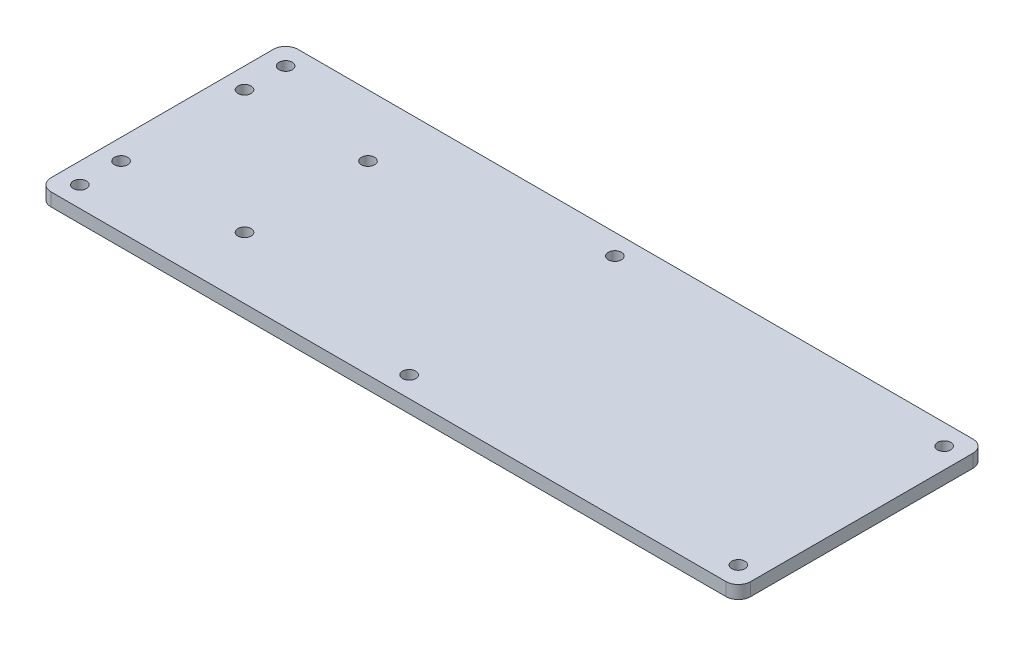
ISO-10303-21;
HEADER;
FILE_DESCRIPTION(('STEP AP214'),'2;1');
FILE_NAME('part.step','',(''),(''),'','','');
FILE_SCHEMA(('AUTOMOTIVE_DESIGN { 1 0 10303 214 1 1 1 1 }'));
ENDSEC;
DATA;
#1=APPLICATION_CONTEXT('core data for automotive mechanical design processes');
#2=APPLICATION_PROTOCOL_DEFINITION('international standard','automotive_design',2000,#1);
#3=PRODUCT_CONTEXT('',#1,'mechanical');
#4=PRODUCT('Part','Part','',(#3));
#5=PRODUCT_RELATED_PRODUCT_CATEGORY('part','',(#4));
#6=PRODUCT_DEFINITION_FORMATION('','',#4);
#7=PRODUCT_DEFINITION_CONTEXT('part definition',#1,'design');
#8=PRODUCT_DEFINITION('design','',#6,#7);
#9=PRODUCT_DEFINITION_SHAPE('','',#8);
#10=(LENGTH_UNIT() NAMED_UNIT(*) SI_UNIT(.MILLI.,.METRE.));
#11=(NAMED_UNIT(*) PLANE_ANGLE_UNIT() SI_UNIT($,.RADIAN.));
#12=(NAMED_UNIT(*) SI_UNIT($,.STERADIAN.) SOLID_ANGLE_UNIT());
#13=UNCERTAINTY_MEASURE_WITH_UNIT(LENGTH_MEASURE(1.E-05),#10,'distance_accuracy_value','');
#14=(GEOMETRIC_REPRESENTATION_CONTEXT(3) GLOBAL_UNCERTAINTY_ASSIGNED_CONTEXT((#13)) GLOBAL_UNIT_ASSIGNED_CONTEXT((#10,
#11,#12)) REPRESENTATION_CONTEXT('',''));
#15=CARTESIAN_POINT('',(0.,0.,0.));
#16=DIRECTION('',(0.,0.,1.));
#17=DIRECTION('',(1.,0.,0.));
#18=AXIS2_PLACEMENT_3D('',#15,#16,#17);
#19=CARTESIAN_POINT('',(85.,3.175,-30.));
#20=DIRECTION('',(-1.,0.,0.));
#21=DIRECTION('',(0.,0.,1.));
#22=AXIS2_PLACEMENT_3D('',#19,#20,#21);
#23=PLANE('',#22);
#24=DIRECTION('',(0.,0.,-1.));
#25=VECTOR('',#24,1.);
#26=CARTESIAN_POINT('',(85.,3.175,-30.));
#27=LINE('',#26,#25);
#28=CARTESIAN_POINT('',(85.,3.175,27.));
#29=VERTEX_POINT('',#28);
#30=CARTESIAN_POINT('',(85.,3.175,-27.));
#31=VERTEX_POINT('',#30);
#32=EDGE_CURVE('E119',#29,#31,#27,.T.);
#33=ORIENTED_EDGE('',*,*,#32,.F.);
#34=DIRECTION('',(0.,-1.,0.));
#35=VECTOR('',#34,1.);
#36=CARTESIAN_POINT('',(85.,3.175,27.));
#37=LINE('',#36,#35);
#38=CARTESIAN_POINT('',(85.,0.,27.));
#39=VERTEX_POINT('',#38);
#40=EDGE_CURVE('E104',#29,#39,#37,.T.);
#41=ORIENTED_EDGE('',*,*,#40,.T.);
#42=DIRECTION('',(0.,0.,-1.));
#43=VECTOR('',#42,1.);
#44=CARTESIAN_POINT('',(85.,0.,-30.));
#45=LINE('',#44,#43);
#46=CARTESIAN_POINT('',(85.,0.,-27.));
#47=VERTEX_POINT('',#46);
#48=EDGE_CURVE('E116',#39,#47,#45,.T.);
#49=ORIENTED_EDGE('',*,*,#48,.T.);
#50=DIRECTION('',(0.,-1.,0.));
#51=VECTOR('',#50,1.);
#52=CARTESIAN_POINT('',(85.,3.175,-27.));
#53=LINE('',#52,#51);
#54=EDGE_CURVE('E121',#47,#31,#53,.F.);
#55=ORIENTED_EDGE('',*,*,#54,.T.);
#56=EDGE_LOOP('',(#33,#41,#49,#55));
#57=FACE_BOUND('',#56,.T.);
#58=ADVANCED_FACE('F34',(#57),#23,.F.);
#59=CARTESIAN_POINT('',(-85.,3.175,-30.));
#60=DIRECTION('',(0.,0.,1.));
#61=DIRECTION('',(1.,0.,0.));
#62=AXIS2_PLACEMENT_3D('',#59,#60,#61);
#63=PLANE('',#62);
#64=DIRECTION('',(-1.,0.,0.));
#65=VECTOR('',#64,1.);
#66=CARTESIAN_POINT('',(-85.,3.175,-30.));
#67=LINE('',#66,#65);
#68=CARTESIAN_POINT('',(82.,3.175,-30.));
#69=VERTEX_POINT('',#68);
#70=CARTESIAN_POINT('',(-82.,3.175,-30.));
#71=VERTEX_POINT('',#70);
#72=EDGE_CURVE('E165',#69,#71,#67,.T.);
#73=ORIENTED_EDGE('',*,*,#72,.F.);
#74=DIRECTION('',(0.,-1.,0.));
#75=VECTOR('',#74,1.);
#76=CARTESIAN_POINT('',(82.,3.175,-30.));
#77=LINE('',#76,#75);
#78=CARTESIAN_POINT('',(82.,0.,-30.));
#79=VERTEX_POINT('',#78);
#80=EDGE_CURVE('E158',#69,#79,#77,.T.);
#81=ORIENTED_EDGE('',*,*,#80,.T.);
#82=DIRECTION('',(-1.,0.,0.));
#83=VECTOR('',#82,1.);
#84=CARTESIAN_POINT('',(-85.,0.,-30.));
#85=LINE('',#84,#83);
#86=CARTESIAN_POINT('',(-82.,0.,-30.));
#87=VERTEX_POINT('',#86);
#88=EDGE_CURVE('E125',#79,#87,#85,.T.);
#89=ORIENTED_EDGE('',*,*,#88,.T.);
#90=DIRECTION('',(0.,-1.,0.));
#91=VECTOR('',#90,1.);
#92=CARTESIAN_POINT('',(-82.,3.175,-30.));
#93=LINE('',#92,#91);
#94=EDGE_CURVE('E156',#87,#71,#93,.F.);
#95=ORIENTED_EDGE('',*,*,#94,.T.);
#96=EDGE_LOOP('',(#73,#81,#89,#95));
#97=FACE_BOUND('',#96,.T.);
#98=ADVANCED_FACE('F163',(#97),#63,.F.);
#99=CARTESIAN_POINT('',(-85.,3.175,-30.));
#100=DIRECTION('',(1.,0.,0.));
#101=DIRECTION('',(0.,0.,-1.));
#102=AXIS2_PLACEMENT_3D('',#99,#100,#101);
#103=PLANE('',#102);
#104=DIRECTION('',(0.,0.,1.));
#105=VECTOR('',#104,1.);
#106=CARTESIAN_POINT('',(-85.,3.175,-30.));
#107=LINE('',#106,#105);
#108=CARTESIAN_POINT('',(-85.,3.175,-27.));
#109=VERTEX_POINT('',#108);
#110=CARTESIAN_POINT('',(-85.,3.175,27.));
#111=VERTEX_POINT('',#110);
#112=EDGE_CURVE('E173',#109,#111,#107,.T.);
#113=ORIENTED_EDGE('',*,*,#112,.F.);
#114=DIRECTION('',(0.,-1.,0.));
#115=VECTOR('',#114,1.);
#116=CARTESIAN_POINT('',(-85.,3.175,-27.));
#117=LINE('',#116,#115);
#118=CARTESIAN_POINT('',(-85.,0.,-27.));
#119=VERTEX_POINT('',#118);
#120=EDGE_CURVE('E11',#109,#119,#117,.T.);
#121=ORIENTED_EDGE('',*,*,#120,.T.);
#122=DIRECTION('',(0.,0.,1.));
#123=VECTOR('',#122,1.);
#124=CARTESIAN_POINT('',(-85.,0.,-30.));
#125=LINE('',#124,#123);
#126=CARTESIAN_POINT('',(-85.,0.,27.));
#127=VERTEX_POINT('',#126);
#128=EDGE_CURVE('E129',#119,#127,#125,.T.);
#129=ORIENTED_EDGE('',*,*,#128,.T.);
#130=DIRECTION('',(0.,-1.,0.));
#131=VECTOR('',#130,1.);
#132=CARTESIAN_POINT('',(-85.,3.175,27.));
#133=LINE('',#132,#131);
#134=EDGE_CURVE('E42',#127,#111,#133,.F.);
#135=ORIENTED_EDGE('',*,*,#134,.T.);
#136=EDGE_LOOP('',(#113,#121,#129,#135));
#137=FACE_BOUND('',#136,.T.);
#138=ADVANCED_FACE('F172',(#137),#103,.F.);
#139=CARTESIAN_POINT('',(-85.,3.175,30.));
#140=DIRECTION('',(0.,0.,-1.));
#141=DIRECTION('',(-1.,0.,0.));
#142=AXIS2_PLACEMENT_3D('',#139,#140,#141);
#143=PLANE('',#142);
#144=DIRECTION('',(1.,0.,0.));
#145=VECTOR('',#144,1.);
#146=CARTESIAN_POINT('',(-85.,0.,30.));
#147=LINE('',#146,#145);
#148=CARTESIAN_POINT('',(-82.,0.,30.));
#149=VERTEX_POINT('',#148);
#150=CARTESIAN_POINT('',(82.,0.,30.));
#151=VERTEX_POINT('',#150);
#152=EDGE_CURVE('E139',#149,#151,#147,.T.);
#153=ORIENTED_EDGE('',*,*,#152,.T.);
#154=DIRECTION('',(0.,-1.,0.));
#155=VECTOR('',#154,1.);
#156=CARTESIAN_POINT('',(82.,3.175,30.));
#157=LINE('',#156,#155);
#158=CARTESIAN_POINT('',(82.,3.175,30.));
#159=VERTEX_POINT('',#158);
#160=EDGE_CURVE('E105',#151,#159,#157,.F.);
#161=ORIENTED_EDGE('',*,*,#160,.T.);
#162=DIRECTION('',(1.,0.,0.));
#163=VECTOR('',#162,1.);
#164=CARTESIAN_POINT('',(-85.,3.175,30.));
#165=LINE('',#164,#163);
#166=CARTESIAN_POINT('',(-82.,3.175,30.));
#167=VERTEX_POINT('',#166);
#168=EDGE_CURVE('E135',#167,#159,#165,.T.);
#169=ORIENTED_EDGE('',*,*,#168,.F.);
#170=DIRECTION('',(0.,-1.,0.));
#171=VECTOR('',#170,1.);
#172=CARTESIAN_POINT('',(-82.,3.175,30.));
#173=LINE('',#172,#171);
#174=EDGE_CURVE('E110',#167,#149,#173,.T.);
#175=ORIENTED_EDGE('',*,*,#174,.T.);
#176=EDGE_LOOP('',(#153,#161,#169,#175));
#177=FACE_BOUND('',#176,.T.);
#178=ADVANCED_FACE('F248',(#177),#143,.F.);
#179=CARTESIAN_POINT('',(0.,3.175,0.));
#180=DIRECTION('',(0.,1.,0.));
#181=DIRECTION('',(0.,0.,1.));
#182=AXIS2_PLACEMENT_3D('',#179,#180,#181);
#183=PLANE('',#182);
#184=CARTESIAN_POINT('',(-80.,3.175,-15.));
#185=DIRECTION('',(0.,1.,0.));
#186=DIRECTION('',(0.,0.,-1.));
#187=AXIS2_PLACEMENT_3D('',#184,#185,#186);
#188=CIRCLE('',#187,1.59999999999999);
#189=CARTESIAN_POINT('',(-80.,3.175,-16.6));
#190=VERTEX_POINT('',#189);
#191=EDGE_CURVE('E230',#190,#190,#188,.T.);
#192=ORIENTED_EDGE('',*,*,#191,.F.);
#193=EDGE_LOOP('',(#192));
#194=FACE_BOUND('',#193,.T.);
#195=CARTESIAN_POINT('',(-50.,3.175,-15.));
#196=DIRECTION('',(0.,1.,0.));
#197=DIRECTION('',(0.,0.,1.));
#198=AXIS2_PLACEMENT_3D('',#195,#196,#197);
#199=CIRCLE('',#198,1.59999999999999);
#200=CARTESIAN_POINT('',(-50.,3.175,-13.4));
#201=VERTEX_POINT('',#200);
#202=EDGE_CURVE('E224',#201,#201,#199,.T.);
#203=ORIENTED_EDGE('',*,*,#202,.F.);
#204=EDGE_LOOP('',(#203));
#205=FACE_BOUND('',#204,.T.);
#206=CARTESIAN_POINT('',(-50.,3.175,15.));
#207=DIRECTION('',(0.,1.,0.));
#208=DIRECTION('',(0.,0.,-1.));
#209=AXIS2_PLACEMENT_3D('',#206,#207,#208);
#210=CIRCLE('',#209,1.6);
#211=CARTESIAN_POINT('',(-50.,3.175,13.4));
#212=VERTEX_POINT('',#211);
#213=EDGE_CURVE('E218',#212,#212,#210,.T.);
#214=ORIENTED_EDGE('',*,*,#213,.F.);
#215=EDGE_LOOP('',(#214));
#216=FACE_BOUND('',#215,.T.);
#217=CARTESIAN_POINT('',(-80.,3.175,15.));
#218=DIRECTION('',(0.,1.,0.));
#219=DIRECTION('',(0.,0.,1.));
#220=AXIS2_PLACEMENT_3D('',#217,#218,#219);
#221=CIRCLE('',#220,1.6);
#222=CARTESIAN_POINT('',(-80.,3.175,16.6));
#223=VERTEX_POINT('',#222);
#224=EDGE_CURVE('E212',#223,#223,#221,.T.);
#225=ORIENTED_EDGE('',*,*,#224,.F.);
#226=EDGE_LOOP('',(#225));
#227=FACE_BOUND('',#226,.T.);
#228=CARTESIAN_POINT('',(0.,3.175,-25.));
#229=DIRECTION('',(0.,1.,0.));
#230=DIRECTION('',(0.,0.,-1.));
#231=AXIS2_PLACEMENT_3D('',#228,#229,#230);
#232=CIRCLE('',#231,1.6);
#233=CARTESIAN_POINT('',(0.,3.175,-26.6));
#234=VERTEX_POINT('',#233);
#235=EDGE_CURVE('E194',#234,#234,#232,.T.);
#236=ORIENTED_EDGE('',*,*,#235,.F.);
#237=EDGE_LOOP('',(#236));
#238=FACE_BOUND('',#237,.T.);
#239=CARTESIAN_POINT('',(0.,3.175,25.));
#240=DIRECTION('',(0.,1.,0.));
#241=DIRECTION('',(0.,0.,1.));
#242=AXIS2_PLACEMENT_3D('',#239,#240,#241);
#243=CIRCLE('',#242,1.6);
#244=CARTESIAN_POINT('',(0.,3.175,26.6));
#245=VERTEX_POINT('',#244);
#246=EDGE_CURVE('E201',#245,#245,#243,.T.);
#247=ORIENTED_EDGE('',*,*,#246,.F.);
#248=EDGE_LOOP('',(#247));
#249=FACE_BOUND('',#248,.T.);
#250=CARTESIAN_POINT('',(80.,3.175,25.));
#251=DIRECTION('',(0.,1.,0.));
#252=DIRECTION('',(0.,0.,-1.));
#253=AXIS2_PLACEMENT_3D('',#250,#251,#252);
#254=CIRCLE('',#253,1.6);
#255=CARTESIAN_POINT('',(80.,3.175,23.4));
#256=VERTEX_POINT('',#255);
#257=EDGE_CURVE('E207',#256,#256,#254,.T.);
#258=ORIENTED_EDGE('',*,*,#257,.F.);
#259=EDGE_LOOP('',(#258));
#260=FACE_BOUND('',#259,.T.);
#261=CARTESIAN_POINT('',(80.,3.175,-25.));
#262=DIRECTION('',(0.,1.,0.));
#263=DIRECTION('',(0.,0.,1.));
#264=AXIS2_PLACEMENT_3D('',#261,#262,#263);
#265=CIRCLE('',#264,1.6);
#266=CARTESIAN_POINT('',(80.,3.175,-23.4));
#267=VERTEX_POINT('',#266);
#268=EDGE_CURVE('E182',#267,#267,#265,.T.);
#269=ORIENTED_EDGE('',*,*,#268,.F.);
#270=EDGE_LOOP('',(#269));
#271=FACE_BOUND('',#270,.T.);
#272=CARTESIAN_POINT('',(-80.,3.175,-25.));
#273=DIRECTION('',(0.,1.,0.));
#274=DIRECTION('',(0.,0.,-1.));
#275=AXIS2_PLACEMENT_3D('',#272,#273,#274);
#276=CIRCLE('',#275,1.6);
#277=CARTESIAN_POINT('',(-80.,3.175,-26.6));
#278=VERTEX_POINT('',#277);
#279=EDGE_CURVE('E189',#278,#278,#276,.T.);
#280=ORIENTED_EDGE('',*,*,#279,.F.);
#281=EDGE_LOOP('',(#280));
#282=FACE_BOUND('',#281,.T.);
#283=CARTESIAN_POINT('',(-80.,3.175,25.));
#284=DIRECTION('',(0.,1.,0.));
#285=DIRECTION('',(0.,0.,1.));
#286=AXIS2_PLACEMENT_3D('',#283,#284,#285);
#287=CIRCLE('',#286,1.6);
#288=CARTESIAN_POINT('',(-80.,3.175,26.6));
#289=VERTEX_POINT('',#288);
#290=EDGE_CURVE('E132',#289,#289,#287,.T.);
#291=ORIENTED_EDGE('',*,*,#290,.F.);
#292=EDGE_LOOP('',(#291));
#293=FACE_BOUND('',#292,.T.);
#294=ORIENTED_EDGE('',*,*,#168,.T.);
#295=CARTESIAN_POINT('',(82.,3.175,27.));
#296=DIRECTION('',(0.,1.,0.));
#297=DIRECTION('',(0.,0.,1.));
#298=AXIS2_PLACEMENT_3D('',#295,#296,#297);
#299=CIRCLE('',#298,3.);
#300=EDGE_CURVE('E154',#159,#29,#299,.T.);
#301=ORIENTED_EDGE('',*,*,#300,.T.);
#302=ORIENTED_EDGE('',*,*,#32,.T.);
#303=CARTESIAN_POINT('',(82.,3.175,-27.));
#304=DIRECTION('',(0.,1.,0.));
#305=DIRECTION('',(0.,0.,1.));
#306=AXIS2_PLACEMENT_3D('',#303,#304,#305);
#307=CIRCLE('',#306,3.);
#308=EDGE_CURVE('E152',#31,#69,#307,.T.);
#309=ORIENTED_EDGE('',*,*,#308,.T.);
#310=ORIENTED_EDGE('',*,*,#72,.T.);
#311=CARTESIAN_POINT('',(-82.,3.175,-27.));
#312=DIRECTION('',(0.,1.,0.));
#313=DIRECTION('',(0.,0.,1.));
#314=AXIS2_PLACEMENT_3D('',#311,#312,#313);
#315=CIRCLE('',#314,3.);
#316=EDGE_CURVE('E55',#71,#109,#315,.T.);
#317=ORIENTED_EDGE('',*,*,#316,.T.);
#318=ORIENTED_EDGE('',*,*,#112,.T.);
#319=CARTESIAN_POINT('',(-82.,3.175,27.));
#320=DIRECTION('',(0.,1.,0.));
#321=DIRECTION('',(0.,0.,1.));
#322=AXIS2_PLACEMENT_3D('',#319,#320,#321);
#323=CIRCLE('',#322,3.);
#324=EDGE_CURVE('E149',#111,#167,#323,.T.);
#325=ORIENTED_EDGE('',*,*,#324,.T.);
#326=EDGE_LOOP('',(#294,#301,#302,#309,#310,#317,#318,#325));
#327=FACE_BOUND('',#326,.T.);
#328=ADVANCED_FACE('F245',(#194,#205,#216,#227,#238,#249,#260,#271,#282,#293,#327),#183,.T.);
#329=CARTESIAN_POINT('',(0.,0.,0.));
#330=DIRECTION('',(0.,1.,0.));
#331=DIRECTION('',(0.,0.,1.));
#332=AXIS2_PLACEMENT_3D('',#329,#330,#331);
#333=PLANE('',#332);
#334=CARTESIAN_POINT('',(-80.,0.,-15.));
#335=DIRECTION('',(0.,1.,0.));
#336=DIRECTION('',(0.,0.,-1.));
#337=AXIS2_PLACEMENT_3D('',#334,#335,#336);
#338=CIRCLE('',#337,1.59999999999999);
#339=CARTESIAN_POINT('',(-80.,0.,-16.6));
#340=VERTEX_POINT('',#339);
#341=EDGE_CURVE('E215',#340,#340,#338,.T.);
#342=ORIENTED_EDGE('',*,*,#341,.T.);
#343=EDGE_LOOP('',(#342));
#344=FACE_BOUND('',#343,.T.);
#345=CARTESIAN_POINT('',(-50.,0.,-15.));
#346=DIRECTION('',(0.,1.,0.));
#347=DIRECTION('',(0.,0.,1.));
#348=AXIS2_PLACEMENT_3D('',#345,#346,#347);
#349=CIRCLE('',#348,1.59999999999999);
#350=CARTESIAN_POINT('',(-50.,0.,-13.4));
#351=VERTEX_POINT('',#350);
#352=EDGE_CURVE('E227',#351,#351,#349,.T.);
#353=ORIENTED_EDGE('',*,*,#352,.T.);
#354=EDGE_LOOP('',(#353));
#355=FACE_BOUND('',#354,.T.);
#356=CARTESIAN_POINT('',(-50.,0.,15.));
#357=DIRECTION('',(0.,1.,0.));
#358=DIRECTION('',(0.,0.,-1.));
#359=AXIS2_PLACEMENT_3D('',#356,#357,#358);
#360=CIRCLE('',#359,1.6);
#361=CARTESIAN_POINT('',(-50.,0.,13.4));
#362=VERTEX_POINT('',#361);
#363=EDGE_CURVE('E221',#362,#362,#360,.T.);
#364=ORIENTED_EDGE('',*,*,#363,.T.);
#365=EDGE_LOOP('',(#364));
#366=FACE_BOUND('',#365,.T.);
#367=CARTESIAN_POINT('',(-80.,0.,15.));
#368=DIRECTION('',(0.,1.,0.));
#369=DIRECTION('',(0.,0.,1.));
#370=AXIS2_PLACEMENT_3D('',#367,#368,#369);
#371=CIRCLE('',#370,1.6);
#372=CARTESIAN_POINT('',(-80.,0.,16.6));
#373=VERTEX_POINT('',#372);
#374=EDGE_CURVE('E198',#373,#373,#371,.T.);
#375=ORIENTED_EDGE('',*,*,#374,.T.);
#376=EDGE_LOOP('',(#375));
#377=FACE_BOUND('',#376,.T.);
#378=CARTESIAN_POINT('',(0.,0.,-25.));
#379=DIRECTION('',(0.,1.,0.));
#380=DIRECTION('',(0.,0.,-1.));
#381=AXIS2_PLACEMENT_3D('',#378,#379,#380);
#382=CIRCLE('',#381,1.6);
#383=CARTESIAN_POINT('',(0.,0.,-26.6));
#384=VERTEX_POINT('',#383);
#385=EDGE_CURVE('E197',#384,#384,#382,.T.);
#386=ORIENTED_EDGE('',*,*,#385,.T.);
#387=EDGE_LOOP('',(#386));
#388=FACE_BOUND('',#387,.T.);
#389=CARTESIAN_POINT('',(0.,0.,25.));
#390=DIRECTION('',(0.,1.,0.));
#391=DIRECTION('',(0.,0.,1.));
#392=AXIS2_PLACEMENT_3D('',#389,#390,#391);
#393=CIRCLE('',#392,1.6);
#394=CARTESIAN_POINT('',(0.,0.,26.6));
#395=VERTEX_POINT('',#394);
#396=EDGE_CURVE('E204',#395,#395,#393,.T.);
#397=ORIENTED_EDGE('',*,*,#396,.T.);
#398=EDGE_LOOP('',(#397));
#399=FACE_BOUND('',#398,.T.);
#400=CARTESIAN_POINT('',(80.,0.,25.));
#401=DIRECTION('',(0.,1.,0.));
#402=DIRECTION('',(0.,0.,-1.));
#403=AXIS2_PLACEMENT_3D('',#400,#401,#402);
#404=CIRCLE('',#403,1.6);
#405=CARTESIAN_POINT('',(80.,0.,23.4));
#406=VERTEX_POINT('',#405);
#407=EDGE_CURVE('E186',#406,#406,#404,.T.);
#408=ORIENTED_EDGE('',*,*,#407,.T.);
#409=EDGE_LOOP('',(#408));
#410=FACE_BOUND('',#409,.T.);
#411=CARTESIAN_POINT('',(80.,0.,-25.));
#412=DIRECTION('',(0.,1.,0.));
#413=DIRECTION('',(0.,0.,1.));
#414=AXIS2_PLACEMENT_3D('',#411,#412,#413);
#415=CIRCLE('',#414,1.6);
#416=CARTESIAN_POINT('',(80.,0.,-23.4));
#417=VERTEX_POINT('',#416);
#418=EDGE_CURVE('E185',#417,#417,#415,.T.);
#419=ORIENTED_EDGE('',*,*,#418,.T.);
#420=EDGE_LOOP('',(#419));
#421=FACE_BOUND('',#420,.T.);
#422=CARTESIAN_POINT('',(-80.,0.,-25.));
#423=DIRECTION('',(0.,1.,0.));
#424=DIRECTION('',(0.,0.,-1.));
#425=AXIS2_PLACEMENT_3D('',#422,#423,#424);
#426=CIRCLE('',#425,1.6);
#427=CARTESIAN_POINT('',(-80.,0.,-26.6));
#428=VERTEX_POINT('',#427);
#429=EDGE_CURVE('E180',#428,#428,#426,.T.);
#430=ORIENTED_EDGE('',*,*,#429,.T.);
#431=EDGE_LOOP('',(#430));
#432=FACE_BOUND('',#431,.T.);
#433=CARTESIAN_POINT('',(-80.,0.,25.));
#434=DIRECTION('',(0.,1.,0.));
#435=DIRECTION('',(0.,0.,1.));
#436=AXIS2_PLACEMENT_3D('',#433,#434,#435);
#437=CIRCLE('',#436,1.6);
#438=CARTESIAN_POINT('',(-80.,0.,26.6));
#439=VERTEX_POINT('',#438);
#440=EDGE_CURVE('E126',#439,#439,#437,.T.);
#441=ORIENTED_EDGE('',*,*,#440,.T.);
#442=EDGE_LOOP('',(#441));
#443=FACE_BOUND('',#442,.T.);
#444=ORIENTED_EDGE('',*,*,#48,.F.);
#445=CARTESIAN_POINT('',(82.,0.,27.));
#446=DIRECTION('',(0.,1.,0.));
#447=DIRECTION('',(0.,0.,1.));
#448=AXIS2_PLACEMENT_3D('',#445,#446,#447);
#449=CIRCLE('',#448,3.);
#450=EDGE_CURVE('E100',#39,#151,#449,.F.);
#451=ORIENTED_EDGE('',*,*,#450,.T.);
#452=ORIENTED_EDGE('',*,*,#152,.F.);
#453=CARTESIAN_POINT('',(-82.,0.,27.));
#454=DIRECTION('',(0.,1.,0.));
#455=DIRECTION('',(0.,0.,1.));
#456=AXIS2_PLACEMENT_3D('',#453,#454,#455);
#457=CIRCLE('',#456,3.);
#458=EDGE_CURVE('E120',#149,#127,#457,.F.);
#459=ORIENTED_EDGE('',*,*,#458,.T.);
#460=ORIENTED_EDGE('',*,*,#128,.F.);
#461=CARTESIAN_POINT('',(-82.,0.,-27.));
#462=DIRECTION('',(0.,1.,0.));
#463=DIRECTION('',(0.,0.,1.));
#464=AXIS2_PLACEMENT_3D('',#461,#462,#463);
#465=CIRCLE('',#464,3.);
#466=EDGE_CURVE('E143',#119,#87,#465,.F.);
#467=ORIENTED_EDGE('',*,*,#466,.T.);
#468=ORIENTED_EDGE('',*,*,#88,.F.);
#469=CARTESIAN_POINT('',(82.,0.,-27.));
#470=DIRECTION('',(0.,1.,0.));
#471=DIRECTION('',(0.,0.,1.));
#472=AXIS2_PLACEMENT_3D('',#469,#470,#471);
#473=CIRCLE('',#472,3.);
#474=EDGE_CURVE('E111',#79,#47,#473,.F.);
#475=ORIENTED_EDGE('',*,*,#474,.T.);
#476=EDGE_LOOP('',(#444,#451,#452,#459,#460,#467,#468,#475));
#477=FACE_BOUND('',#476,.T.);
#478=ADVANCED_FACE('F123',(#344,#355,#366,#377,#388,#399,#410,#421,#432,#443,#477),#333,.F.);
#479=CARTESIAN_POINT('',(-80.,0.,25.));
#480=DIRECTION('',(0.,1.,0.));
#481=DIRECTION('',(0.,0.,1.));
#482=AXIS2_PLACEMENT_3D('',#479,#480,#481);
#483=CYLINDRICAL_SURFACE('',#482,1.6);
#484=ORIENTED_EDGE('',*,*,#440,.F.);
#485=EDGE_LOOP('',(#484));
#486=FACE_BOUND('',#485,.T.);
#487=ORIENTED_EDGE('',*,*,#290,.T.);
#488=EDGE_LOOP('',(#487));
#489=FACE_BOUND('',#488,.T.);
#490=ADVANCED_FACE('F384',(#486,#489),#483,.F.);
#491=CARTESIAN_POINT('',(-80.,0.,-25.));
#492=DIRECTION('',(0.,1.,0.));
#493=DIRECTION('',(0.,0.,1.));
#494=AXIS2_PLACEMENT_3D('',#491,#492,#493);
#495=CYLINDRICAL_SURFACE('',#494,1.6);
#496=ORIENTED_EDGE('',*,*,#429,.F.);
#497=EDGE_LOOP('',(#496));
#498=FACE_BOUND('',#497,.T.);
#499=ORIENTED_EDGE('',*,*,#279,.T.);
#500=EDGE_LOOP('',(#499));
#501=FACE_BOUND('',#500,.T.);
#502=ADVANCED_FACE('F375',(#498,#501),#495,.F.);
#503=CARTESIAN_POINT('',(80.,0.,-25.));
#504=DIRECTION('',(0.,1.,0.));
#505=DIRECTION('',(0.,0.,1.));
#506=AXIS2_PLACEMENT_3D('',#503,#504,#505);
#507=CYLINDRICAL_SURFACE('',#506,1.6);
#508=ORIENTED_EDGE('',*,*,#418,.F.);
#509=EDGE_LOOP('',(#508));
#510=FACE_BOUND('',#509,.T.);
#511=ORIENTED_EDGE('',*,*,#268,.T.);
#512=EDGE_LOOP('',(#511));
#513=FACE_BOUND('',#512,.T.);
#514=ADVANCED_FACE('F366',(#510,#513),#507,.F.);
#515=CARTESIAN_POINT('',(80.,0.,25.));
#516=DIRECTION('',(0.,1.,0.));
#517=DIRECTION('',(0.,0.,1.));
#518=AXIS2_PLACEMENT_3D('',#515,#516,#517);
#519=CYLINDRICAL_SURFACE('',#518,1.6);
#520=ORIENTED_EDGE('',*,*,#407,.F.);
#521=EDGE_LOOP('',(#520));
#522=FACE_BOUND('',#521,.T.);
#523=ORIENTED_EDGE('',*,*,#257,.T.);
#524=EDGE_LOOP('',(#523));
#525=FACE_BOUND('',#524,.T.);
#526=ADVANCED_FACE('F357',(#522,#525),#519,.F.);
#527=CARTESIAN_POINT('',(0.,0.,25.));
#528=DIRECTION('',(0.,1.,0.));
#529=DIRECTION('',(0.,0.,1.));
#530=AXIS2_PLACEMENT_3D('',#527,#528,#529);
#531=CYLINDRICAL_SURFACE('',#530,1.6);
#532=ORIENTED_EDGE('',*,*,#396,.F.);
#533=EDGE_LOOP('',(#532));
#534=FACE_BOUND('',#533,.T.);
#535=ORIENTED_EDGE('',*,*,#246,.T.);
#536=EDGE_LOOP('',(#535));
#537=FACE_BOUND('',#536,.T.);
#538=ADVANCED_FACE('F348',(#534,#537),#531,.F.);
#539=CARTESIAN_POINT('',(0.,0.,-25.));
#540=DIRECTION('',(0.,1.,0.));
#541=DIRECTION('',(0.,0.,1.));
#542=AXIS2_PLACEMENT_3D('',#539,#540,#541);
#543=CYLINDRICAL_SURFACE('',#542,1.6);
#544=ORIENTED_EDGE('',*,*,#385,.F.);
#545=EDGE_LOOP('',(#544));
#546=FACE_BOUND('',#545,.T.);
#547=ORIENTED_EDGE('',*,*,#235,.T.);
#548=EDGE_LOOP('',(#547));
#549=FACE_BOUND('',#548,.T.);
#550=ADVANCED_FACE('F339',(#546,#549),#543,.F.);
#551=CARTESIAN_POINT('',(-80.,0.,15.));
#552=DIRECTION('',(0.,1.,0.));
#553=DIRECTION('',(0.,0.,1.));
#554=AXIS2_PLACEMENT_3D('',#551,#552,#553);
#555=CYLINDRICAL_SURFACE('',#554,1.6);
#556=ORIENTED_EDGE('',*,*,#374,.F.);
#557=EDGE_LOOP('',(#556));
#558=FACE_BOUND('',#557,.T.);
#559=ORIENTED_EDGE('',*,*,#224,.T.);
#560=EDGE_LOOP('',(#559));
#561=FACE_BOUND('',#560,.T.);
#562=ADVANCED_FACE('F330',(#558,#561),#555,.F.);
#563=CARTESIAN_POINT('',(-50.,0.,15.));
#564=DIRECTION('',(0.,1.,0.));
#565=DIRECTION('',(0.,0.,1.));
#566=AXIS2_PLACEMENT_3D('',#563,#564,#565);
#567=CYLINDRICAL_SURFACE('',#566,1.6);
#568=ORIENTED_EDGE('',*,*,#363,.F.);
#569=EDGE_LOOP('',(#568));
#570=FACE_BOUND('',#569,.T.);
#571=ORIENTED_EDGE('',*,*,#213,.T.);
#572=EDGE_LOOP('',(#571));
#573=FACE_BOUND('',#572,.T.);
#574=ADVANCED_FACE('F321',(#570,#573),#567,.F.);
#575=CARTESIAN_POINT('',(-50.,0.,-15.));
#576=DIRECTION('',(0.,1.,0.));
#577=DIRECTION('',(0.,0.,1.));
#578=AXIS2_PLACEMENT_3D('',#575,#576,#577);
#579=CYLINDRICAL_SURFACE('',#578,1.59999999999999);
#580=ORIENTED_EDGE('',*,*,#352,.F.);
#581=EDGE_LOOP('',(#580));
#582=FACE_BOUND('',#581,.T.);
#583=ORIENTED_EDGE('',*,*,#202,.T.);
#584=EDGE_LOOP('',(#583));
#585=FACE_BOUND('',#584,.T.);
#586=ADVANCED_FACE('F241',(#582,#585),#579,.F.);
#587=CARTESIAN_POINT('',(-80.,0.,-15.));
#588=DIRECTION('',(0.,1.,0.));
#589=DIRECTION('',(0.,0.,1.));
#590=AXIS2_PLACEMENT_3D('',#587,#588,#589);
#591=CYLINDRICAL_SURFACE('',#590,1.59999999999999);
#592=ORIENTED_EDGE('',*,*,#341,.F.);
#593=EDGE_LOOP('',(#592));
#594=FACE_BOUND('',#593,.T.);
#595=ORIENTED_EDGE('',*,*,#191,.T.);
#596=EDGE_LOOP('',(#595));
#597=FACE_BOUND('',#596,.T.);
#598=ADVANCED_FACE('F238',(#594,#597),#591,.F.);
#599=CARTESIAN_POINT('',(82.,3.175,27.));
#600=DIRECTION('',(0.,-1.,0.));
#601=DIRECTION('',(0.,0.,-1.));
#602=AXIS2_PLACEMENT_3D('',#599,#600,#601);
#603=CYLINDRICAL_SURFACE('',#602,3.);
#604=ORIENTED_EDGE('',*,*,#300,.F.);
#605=ORIENTED_EDGE('',*,*,#160,.F.);
#606=ORIENTED_EDGE('',*,*,#450,.F.);
#607=ORIENTED_EDGE('',*,*,#40,.F.);
#608=EDGE_LOOP('',(#604,#605,#606,#607));
#609=FACE_BOUND('',#608,.T.);
#610=ADVANCED_FACE('F103',(#609),#603,.T.);
#611=CARTESIAN_POINT('',(82.,3.175,-27.));
#612=DIRECTION('',(0.,-1.,0.));
#613=DIRECTION('',(0.,0.,-1.));
#614=AXIS2_PLACEMENT_3D('',#611,#612,#613);
#615=CYLINDRICAL_SURFACE('',#614,3.);
#616=ORIENTED_EDGE('',*,*,#308,.F.);
#617=ORIENTED_EDGE('',*,*,#54,.F.);
#618=ORIENTED_EDGE('',*,*,#474,.F.);
#619=ORIENTED_EDGE('',*,*,#80,.F.);
#620=EDGE_LOOP('',(#616,#617,#618,#619));
#621=FACE_BOUND('',#620,.T.);
#622=ADVANCED_FACE('F275',(#621),#615,.T.);
#623=CARTESIAN_POINT('',(-82.,3.175,-27.));
#624=DIRECTION('',(0.,-1.,0.));
#625=DIRECTION('',(0.,0.,-1.));
#626=AXIS2_PLACEMENT_3D('',#623,#624,#625);
#627=CYLINDRICAL_SURFACE('',#626,3.);
#628=ORIENTED_EDGE('',*,*,#316,.F.);
#629=ORIENTED_EDGE('',*,*,#94,.F.);
#630=ORIENTED_EDGE('',*,*,#466,.F.);
#631=ORIENTED_EDGE('',*,*,#120,.F.);
#632=EDGE_LOOP('',(#628,#629,#630,#631));
#633=FACE_BOUND('',#632,.T.);
#634=ADVANCED_FACE('F171',(#633),#627,.T.);
#635=CARTESIAN_POINT('',(-82.,3.175,27.));
#636=DIRECTION('',(0.,-1.,0.));
#637=DIRECTION('',(0.,0.,-1.));
#638=AXIS2_PLACEMENT_3D('',#635,#636,#637);
#639=CYLINDRICAL_SURFACE('',#638,3.);
#640=ORIENTED_EDGE('',*,*,#324,.F.);
#641=ORIENTED_EDGE('',*,*,#134,.F.);
#642=ORIENTED_EDGE('',*,*,#458,.F.);
#643=ORIENTED_EDGE('',*,*,#174,.F.);
#644=EDGE_LOOP('',(#640,#641,#642,#643));
#645=FACE_BOUND('',#644,.T.);
#646=ADVANCED_FACE('F36',(#645),#639,.T.);
#647=CLOSED_SHELL('',(#58,#98,#138,#178,#328,#478,#490,#502,#514,#526,#538,#550,#562,#574,#586,
#598,#610,#622,#634,#646));
#648=MANIFOLD_SOLID_BREP('B2',#647);
#649=ADVANCED_BREP_SHAPE_REPRESENTATION('',(#18,#648),#14);
#650=SHAPE_DEFINITION_REPRESENTATION(#9,#649);
ENDSEC;
END-ISO-10303-21;
